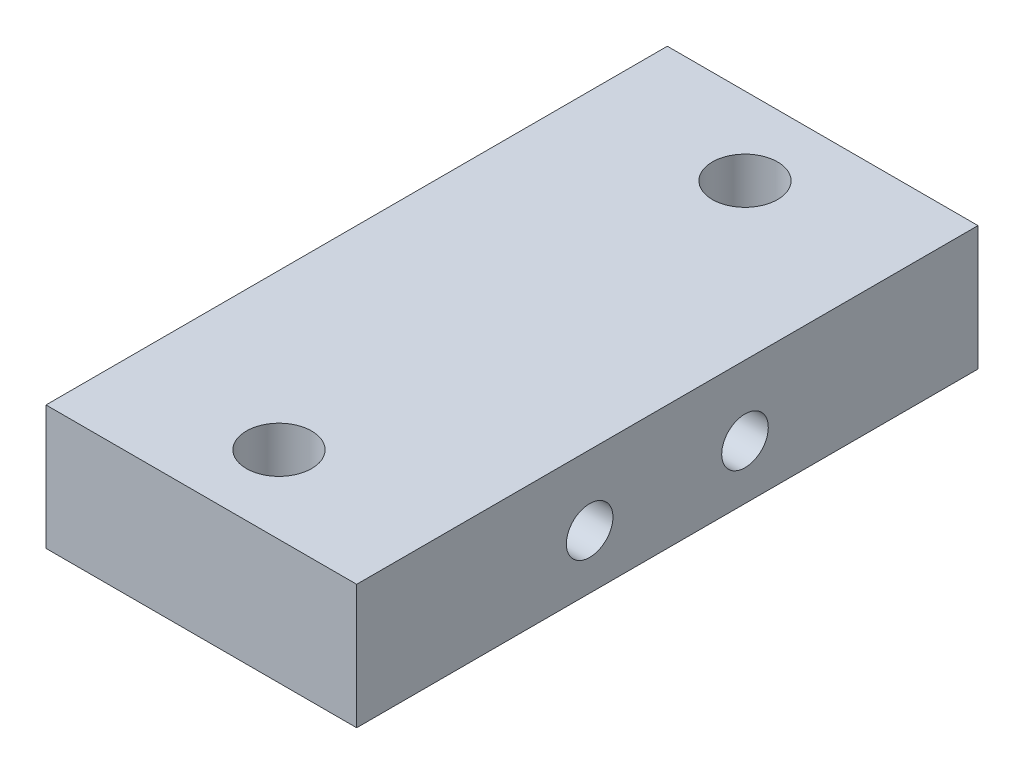
ISO-10303-21;
HEADER;
FILE_DESCRIPTION(('STEP AP214'),'2;1');
FILE_NAME('part.step','',(''),(''),'','','');
FILE_SCHEMA(('AUTOMOTIVE_DESIGN { 1 0 10303 214 1 1 1 1 }'));
ENDSEC;
DATA;
#1=APPLICATION_CONTEXT('core data for automotive mechanical design processes');
#2=APPLICATION_PROTOCOL_DEFINITION('international standard','automotive_design',2000,#1);
#3=PRODUCT_CONTEXT('',#1,'mechanical');
#4=PRODUCT('Part','Part','',(#3));
#5=PRODUCT_RELATED_PRODUCT_CATEGORY('part','',(#4));
#6=PRODUCT_DEFINITION_FORMATION('','',#4);
#7=PRODUCT_DEFINITION_CONTEXT('part definition',#1,'design');
#8=PRODUCT_DEFINITION('design','',#6,#7);
#9=PRODUCT_DEFINITION_SHAPE('','',#8);
#10=(LENGTH_UNIT() NAMED_UNIT(*) SI_UNIT(.MILLI.,.METRE.));
#11=(NAMED_UNIT(*) PLANE_ANGLE_UNIT() SI_UNIT($,.RADIAN.));
#12=(NAMED_UNIT(*) SI_UNIT($,.STERADIAN.) SOLID_ANGLE_UNIT());
#13=UNCERTAINTY_MEASURE_WITH_UNIT(LENGTH_MEASURE(1.E-05),#10,'distance_accuracy_value','');
#14=(GEOMETRIC_REPRESENTATION_CONTEXT(3) GLOBAL_UNCERTAINTY_ASSIGNED_CONTEXT((#13)) GLOBAL_UNIT_ASSIGNED_CONTEXT((#10,
#11,#12)) REPRESENTATION_CONTEXT('',''));
#15=CARTESIAN_POINT('',(0.,0.,0.));
#16=DIRECTION('',(0.,0.,1.));
#17=DIRECTION('',(1.,0.,0.));
#18=AXIS2_PLACEMENT_3D('',#15,#16,#17);
#19=CARTESIAN_POINT('',(-70.0000000000051,41.7572835184049,-10.4999999999994));
#20=DIRECTION('',(-1.,0.,0.));
#21=DIRECTION('',(0.,-1.,0.));
#22=AXIS2_PLACEMENT_3D('',#19,#20,#21);
#23=PLANE('',#22);
#24=CARTESIAN_POINT('',(-70.0000000000051,37.2572835184107,-35.5000000000003));
#25=DIRECTION('',(1.,0.,0.));
#26=DIRECTION('',(0.,1.,0.));
#27=AXIS2_PLACEMENT_3D('',#24,#25,#26);
#28=CIRCLE('',#27,1.5);
#29=CARTESIAN_POINT('',(-70.0000000000051,38.7572835184107,-35.5000000000003));
#30=VERTEX_POINT('',#29);
#31=EDGE_CURVE('E128',#30,#30,#28,.T.);
#32=ORIENTED_EDGE('',*,*,#31,.F.);
#33=EDGE_LOOP('',(#32));
#34=FACE_BOUND('',#33,.T.);
#35=CARTESIAN_POINT('',(-70.0000000000051,37.2572835184107,-25.5000000000003));
#36=DIRECTION('',(1.,0.,0.));
#37=DIRECTION('',(0.,1.,0.));
#38=AXIS2_PLACEMENT_3D('',#35,#36,#37);
#39=CIRCLE('',#38,1.5);
#40=CARTESIAN_POINT('',(-70.0000000000051,38.7572835184107,-25.5000000000003));
#41=VERTEX_POINT('',#40);
#42=EDGE_CURVE('E125',#41,#41,#39,.T.);
#43=ORIENTED_EDGE('',*,*,#42,.F.);
#44=EDGE_LOOP('',(#43));
#45=FACE_BOUND('',#44,.T.);
#46=DIRECTION('',(0.,0.,-1.));
#47=VECTOR('',#46,1.);
#48=CARTESIAN_POINT('',(-70.0000000000051,33.7572835184049,-10.4999999999994));
#49=LINE('',#48,#47);
#50=CARTESIAN_POINT('',(-70.0000000000051,33.7572835184049,-10.4999999999994));
#51=VERTEX_POINT('',#50);
#52=CARTESIAN_POINT('',(-70.0000000000051,33.7572835184049,-50.5));
#53=VERTEX_POINT('',#52);
#54=EDGE_CURVE('E96',#51,#53,#49,.T.);
#55=ORIENTED_EDGE('',*,*,#54,.T.);
#56=DIRECTION('',(0.,-1.,0.));
#57=VECTOR('',#56,1.);
#58=CARTESIAN_POINT('',(-70.0000000000051,41.7572835184049,-50.5));
#59=LINE('',#58,#57);
#60=CARTESIAN_POINT('',(-70.0000000000051,41.7572835184049,-50.5));
#61=VERTEX_POINT('',#60);
#62=EDGE_CURVE('E11',#61,#53,#59,.T.);
#63=ORIENTED_EDGE('',*,*,#62,.F.);
#64=DIRECTION('',(0.,0.,-1.));
#65=VECTOR('',#64,1.);
#66=CARTESIAN_POINT('',(-70.0000000000051,41.7572835184049,-10.4999999999994));
#67=LINE('',#66,#65);
#68=CARTESIAN_POINT('',(-70.0000000000051,41.7572835184049,-10.4999999999994));
#69=VERTEX_POINT('',#68);
#70=EDGE_CURVE('E84',#69,#61,#67,.T.);
#71=ORIENTED_EDGE('',*,*,#70,.F.);
#72=DIRECTION('',(0.,-1.,0.));
#73=VECTOR('',#72,1.);
#74=CARTESIAN_POINT('',(-70.0000000000051,41.7572835184049,-10.4999999999994));
#75=LINE('',#74,#73);
#76=EDGE_CURVE('E92',#69,#51,#75,.T.);
#77=ORIENTED_EDGE('',*,*,#76,.T.);
#78=EDGE_LOOP('',(#55,#63,#71,#77));
#79=FACE_BOUND('',#78,.T.);
#80=ADVANCED_FACE('F33',(#34,#45,#79),#23,.F.);
#81=CARTESIAN_POINT('',(-70.0000000000051,41.7572835184049,-50.5));
#82=DIRECTION('',(0.,0.,1.));
#83=DIRECTION('',(0.,-1.,0.));
#84=AXIS2_PLACEMENT_3D('',#81,#82,#83);
#85=PLANE('',#84);
#86=DIRECTION('',(-1.,0.,0.));
#87=VECTOR('',#86,1.);
#88=CARTESIAN_POINT('',(-70.0000000000051,33.7572835184049,-50.5));
#89=LINE('',#88,#87);
#90=CARTESIAN_POINT('',(-90.0000000000051,33.7572835184049,-50.5));
#91=VERTEX_POINT('',#90);
#92=EDGE_CURVE('E88',#53,#91,#89,.T.);
#93=ORIENTED_EDGE('',*,*,#92,.T.);
#94=DIRECTION('',(0.,-1.,0.));
#95=VECTOR('',#94,1.);
#96=CARTESIAN_POINT('',(-90.0000000000051,41.7572835184049,-50.5));
#97=LINE('',#96,#95);
#98=CARTESIAN_POINT('',(-90.0000000000051,41.7572835184049,-50.5));
#99=VERTEX_POINT('',#98);
#100=EDGE_CURVE('E41',#99,#91,#97,.T.);
#101=ORIENTED_EDGE('',*,*,#100,.F.);
#102=DIRECTION('',(-1.,0.,0.));
#103=VECTOR('',#102,1.);
#104=CARTESIAN_POINT('',(-70.0000000000051,41.7572835184049,-50.5));
#105=LINE('',#104,#103);
#106=EDGE_CURVE('E79',#61,#99,#105,.T.);
#107=ORIENTED_EDGE('',*,*,#106,.F.);
#108=ORIENTED_EDGE('',*,*,#62,.T.);
#109=EDGE_LOOP('',(#93,#101,#107,#108));
#110=FACE_BOUND('',#109,.T.);
#111=ADVANCED_FACE('F87',(#110),#85,.F.);
#112=CARTESIAN_POINT('',(-90.0000000000051,41.7572835184049,-10.4999999999994));
#113=DIRECTION('',(1.,0.,0.));
#114=DIRECTION('',(0.,1.,0.));
#115=AXIS2_PLACEMENT_3D('',#112,#113,#114);
#116=PLANE('',#115);
#117=DIRECTION('',(0.,0.,1.));
#118=VECTOR('',#117,1.);
#119=CARTESIAN_POINT('',(-90.0000000000051,33.7572835184049,-10.4999999999994));
#120=LINE('',#119,#118);
#121=CARTESIAN_POINT('',(-90.0000000000051,33.7572835184049,-10.4999999999994));
#122=VERTEX_POINT('',#121);
#123=EDGE_CURVE('E66',#91,#122,#120,.T.);
#124=ORIENTED_EDGE('',*,*,#123,.T.);
#125=DIRECTION('',(0.,-1.,0.));
#126=VECTOR('',#125,1.);
#127=CARTESIAN_POINT('',(-90.0000000000051,41.7572835184049,-10.4999999999994));
#128=LINE('',#127,#126);
#129=CARTESIAN_POINT('',(-90.0000000000051,41.7572835184049,-10.4999999999994));
#130=VERTEX_POINT('',#129);
#131=EDGE_CURVE('E89',#130,#122,#128,.T.);
#132=ORIENTED_EDGE('',*,*,#131,.F.);
#133=DIRECTION('',(0.,0.,1.));
#134=VECTOR('',#133,1.);
#135=CARTESIAN_POINT('',(-90.0000000000051,41.7572835184049,-10.4999999999994));
#136=LINE('',#135,#134);
#137=EDGE_CURVE('E82',#99,#130,#136,.T.);
#138=ORIENTED_EDGE('',*,*,#137,.F.);
#139=ORIENTED_EDGE('',*,*,#100,.T.);
#140=EDGE_LOOP('',(#124,#132,#138,#139));
#141=FACE_BOUND('',#140,.T.);
#142=ADVANCED_FACE('F90',(#141),#116,.F.);
#143=CARTESIAN_POINT('',(-70.0000000000051,41.7572835184049,-10.4999999999994));
#144=DIRECTION('',(0.,0.,-1.));
#145=DIRECTION('',(0.,1.,0.));
#146=AXIS2_PLACEMENT_3D('',#143,#144,#145);
#147=PLANE('',#146);
#148=DIRECTION('',(1.,0.,0.));
#149=VECTOR('',#148,1.);
#150=CARTESIAN_POINT('',(-70.0000000000051,33.7572835184049,-10.4999999999994));
#151=LINE('',#150,#149);
#152=EDGE_CURVE('E72',#122,#51,#151,.T.);
#153=ORIENTED_EDGE('',*,*,#152,.T.);
#154=ORIENTED_EDGE('',*,*,#76,.F.);
#155=DIRECTION('',(1.,0.,0.));
#156=VECTOR('',#155,1.);
#157=CARTESIAN_POINT('',(-70.0000000000051,41.7572835184049,-10.4999999999994));
#158=LINE('',#157,#156);
#159=EDGE_CURVE('E49',#130,#69,#158,.T.);
#160=ORIENTED_EDGE('',*,*,#159,.F.);
#161=ORIENTED_EDGE('',*,*,#131,.T.);
#162=EDGE_LOOP('',(#153,#154,#160,#161));
#163=FACE_BOUND('',#162,.T.);
#164=ADVANCED_FACE('F104',(#163),#147,.F.);
#165=CARTESIAN_POINT('',(0.,41.7572835184049,0.));
#166=DIRECTION('',(0.,1.,0.));
#167=DIRECTION('',(0.,0.,1.));
#168=AXIS2_PLACEMENT_3D('',#165,#166,#167);
#169=PLANE('',#168);
#170=CARTESIAN_POINT('',(-80.0000000000051,41.7572835184049,-15.4999999999994));
#171=DIRECTION('',(0.,1.,0.));
#172=DIRECTION('',(0.,0.,1.));
#173=AXIS2_PLACEMENT_3D('',#170,#171,#172);
#174=CIRCLE('',#173,2.1);
#175=CARTESIAN_POINT('',(-80.0000000000051,41.7572835184049,-13.3999999999994));
#176=VERTEX_POINT('',#175);
#177=EDGE_CURVE('E113',#176,#176,#174,.T.);
#178=ORIENTED_EDGE('',*,*,#177,.F.);
#179=EDGE_LOOP('',(#178));
#180=FACE_BOUND('',#179,.T.);
#181=CARTESIAN_POINT('',(-80.0000000000051,41.7572835184049,-45.4999999999997));
#182=DIRECTION('',(0.,1.,0.));
#183=DIRECTION('',(0.,0.,1.));
#184=AXIS2_PLACEMENT_3D('',#181,#182,#183);
#185=CIRCLE('',#184,2.1);
#186=CARTESIAN_POINT('',(-80.0000000000051,41.7572835184049,-43.3999999999997));
#187=VERTEX_POINT('',#186);
#188=EDGE_CURVE('E114',#187,#187,#185,.T.);
#189=ORIENTED_EDGE('',*,*,#188,.F.);
#190=EDGE_LOOP('',(#189));
#191=FACE_BOUND('',#190,.T.);
#192=ORIENTED_EDGE('',*,*,#70,.T.);
#193=ORIENTED_EDGE('',*,*,#106,.T.);
#194=ORIENTED_EDGE('',*,*,#137,.T.);
#195=ORIENTED_EDGE('',*,*,#159,.T.);
#196=EDGE_LOOP('',(#192,#193,#194,#195));
#197=FACE_BOUND('',#196,.T.);
#198=ADVANCED_FACE('F80',(#180,#191,#197),#169,.T.);
#199=CARTESIAN_POINT('',(0.,33.7572835184049,0.));
#200=DIRECTION('',(0.,1.,0.));
#201=DIRECTION('',(0.,0.,1.));
#202=AXIS2_PLACEMENT_3D('',#199,#200,#201);
#203=PLANE('',#202);
#204=CARTESIAN_POINT('',(-80.0000000000051,33.7572835184049,-15.4999999999994));
#205=DIRECTION('',(0.,1.,0.));
#206=DIRECTION('',(0.,0.,1.));
#207=AXIS2_PLACEMENT_3D('',#204,#205,#206);
#208=CIRCLE('',#207,2.1);
#209=CARTESIAN_POINT('',(-80.0000000000051,33.7572835184049,-13.3999999999994));
#210=VERTEX_POINT('',#209);
#211=EDGE_CURVE('E99',#210,#210,#208,.F.);
#212=ORIENTED_EDGE('',*,*,#211,.F.);
#213=EDGE_LOOP('',(#212));
#214=FACE_BOUND('',#213,.T.);
#215=CARTESIAN_POINT('',(-80.0000000000051,33.7572835184049,-45.4999999999997));
#216=DIRECTION('',(0.,1.,0.));
#217=DIRECTION('',(0.,0.,1.));
#218=AXIS2_PLACEMENT_3D('',#215,#216,#217);
#219=CIRCLE('',#218,2.1);
#220=CARTESIAN_POINT('',(-80.0000000000051,33.7572835184049,-43.3999999999997));
#221=VERTEX_POINT('',#220);
#222=EDGE_CURVE('E110',#221,#221,#219,.F.);
#223=ORIENTED_EDGE('',*,*,#222,.F.);
#224=EDGE_LOOP('',(#223));
#225=FACE_BOUND('',#224,.T.);
#226=ORIENTED_EDGE('',*,*,#54,.F.);
#227=ORIENTED_EDGE('',*,*,#152,.F.);
#228=ORIENTED_EDGE('',*,*,#123,.F.);
#229=ORIENTED_EDGE('',*,*,#92,.F.);
#230=EDGE_LOOP('',(#226,#227,#228,#229));
#231=FACE_BOUND('',#230,.T.);
#232=ADVANCED_FACE('F107',(#214,#225,#231),#203,.F.);
#233=CARTESIAN_POINT('',(-80.0000000000051,27.8175865564379,-45.4999999999997));
#234=DIRECTION('',(0.,1.,0.));
#235=DIRECTION('',(0.,0.,1.));
#236=AXIS2_PLACEMENT_3D('',#233,#234,#235);
#237=CYLINDRICAL_SURFACE('',#236,2.1);
#238=ORIENTED_EDGE('',*,*,#222,.T.);
#239=EDGE_LOOP('',(#238));
#240=FACE_BOUND('',#239,.T.);
#241=ORIENTED_EDGE('',*,*,#188,.T.);
#242=EDGE_LOOP('',(#241));
#243=FACE_BOUND('',#242,.T.);
#244=ADVANCED_FACE('F158',(#240,#243),#237,.F.);
#245=CARTESIAN_POINT('',(-80.0000000000051,27.8175865564379,-15.4999999999994));
#246=DIRECTION('',(0.,1.,0.));
#247=DIRECTION('',(0.,0.,1.));
#248=AXIS2_PLACEMENT_3D('',#245,#246,#247);
#249=CYLINDRICAL_SURFACE('',#248,2.1);
#250=ORIENTED_EDGE('',*,*,#211,.T.);
#251=EDGE_LOOP('',(#250));
#252=FACE_BOUND('',#251,.T.);
#253=ORIENTED_EDGE('',*,*,#177,.T.);
#254=EDGE_LOOP('',(#253));
#255=FACE_BOUND('',#254,.T.);
#256=ADVANCED_FACE('F149',(#252,#255),#249,.F.);
#257=CARTESIAN_POINT('',(-85.0000000000051,37.2572835184107,-25.5000000000003));
#258=DIRECTION('',(1.,0.,0.));
#259=DIRECTION('',(0.,1.,0.));
#260=AXIS2_PLACEMENT_3D('',#257,#258,#259);
#261=CYLINDRICAL_SURFACE('',#260,1.5);
#262=CARTESIAN_POINT('',(-85.0000000000051,37.2572835184107,-25.5000000000003));
#263=DIRECTION('',(1.,0.,0.));
#264=DIRECTION('',(0.,1.,0.));
#265=AXIS2_PLACEMENT_3D('',#262,#263,#264);
#266=CIRCLE('',#265,1.5);
#267=CARTESIAN_POINT('',(-85.0000000000051,38.7572835184107,-25.5000000000003));
#268=VERTEX_POINT('',#267);
#269=EDGE_CURVE('E122',#268,#268,#266,.T.);
#270=ORIENTED_EDGE('',*,*,#269,.F.);
#271=EDGE_LOOP('',(#270));
#272=FACE_BOUND('',#271,.T.);
#273=ORIENTED_EDGE('',*,*,#42,.T.);
#274=EDGE_LOOP('',(#273));
#275=FACE_BOUND('',#274,.T.);
#276=ADVANCED_FACE('F147',(#272,#275),#261,.F.);
#277=CARTESIAN_POINT('',(-85.0000000000051,37.2572835184107,-25.5000000000003));
#278=DIRECTION('',(1.,0.,0.));
#279=DIRECTION('',(0.,1.,0.));
#280=AXIS2_PLACEMENT_3D('',#277,#278,#279);
#281=PLANE('',#280);
#282=ORIENTED_EDGE('',*,*,#269,.T.);
#283=EDGE_LOOP('',(#282));
#284=FACE_BOUND('',#283,.T.);
#285=ADVANCED_FACE('F139',(#284),#281,.T.);
#286=CARTESIAN_POINT('',(-85.0000000000051,37.2572835184107,-35.5000000000003));
#287=DIRECTION('',(1.,0.,0.));
#288=DIRECTION('',(0.,1.,0.));
#289=AXIS2_PLACEMENT_3D('',#286,#287,#288);
#290=CYLINDRICAL_SURFACE('',#289,1.5);
#291=CARTESIAN_POINT('',(-85.0000000000051,37.2572835184107,-35.5000000000003));
#292=DIRECTION('',(1.,0.,0.));
#293=DIRECTION('',(0.,1.,0.));
#294=AXIS2_PLACEMENT_3D('',#291,#292,#293);
#295=CIRCLE('',#294,1.5);
#296=CARTESIAN_POINT('',(-85.0000000000051,38.7572835184107,-35.5000000000003));
#297=VERTEX_POINT('',#296);
#298=EDGE_CURVE('E117',#297,#297,#295,.T.);
#299=ORIENTED_EDGE('',*,*,#298,.F.);
#300=EDGE_LOOP('',(#299));
#301=FACE_BOUND('',#300,.T.);
#302=ORIENTED_EDGE('',*,*,#31,.T.);
#303=EDGE_LOOP('',(#302));
#304=FACE_BOUND('',#303,.T.);
#305=ADVANCED_FACE('F136',(#301,#304),#290,.F.);
#306=CARTESIAN_POINT('',(-85.0000000000051,37.2572835184107,-35.5000000000003));
#307=DIRECTION('',(1.,0.,0.));
#308=DIRECTION('',(0.,1.,0.));
#309=AXIS2_PLACEMENT_3D('',#306,#307,#308);
#310=PLANE('',#309);
#311=ORIENTED_EDGE('',*,*,#298,.T.);
#312=EDGE_LOOP('',(#311));
#313=FACE_BOUND('',#312,.T.);
#314=ADVANCED_FACE('F134',(#313),#310,.T.);
#315=CLOSED_SHELL('',(#80,#111,#142,#164,#198,#232,#244,#256,#276,#285,#305,#314));
#316=MANIFOLD_SOLID_BREP('B2',#315);
#317=ADVANCED_BREP_SHAPE_REPRESENTATION('',(#18,#316),#14);
#318=SHAPE_DEFINITION_REPRESENTATION(#9,#317);
ENDSEC;
END-ISO-10303-21;
